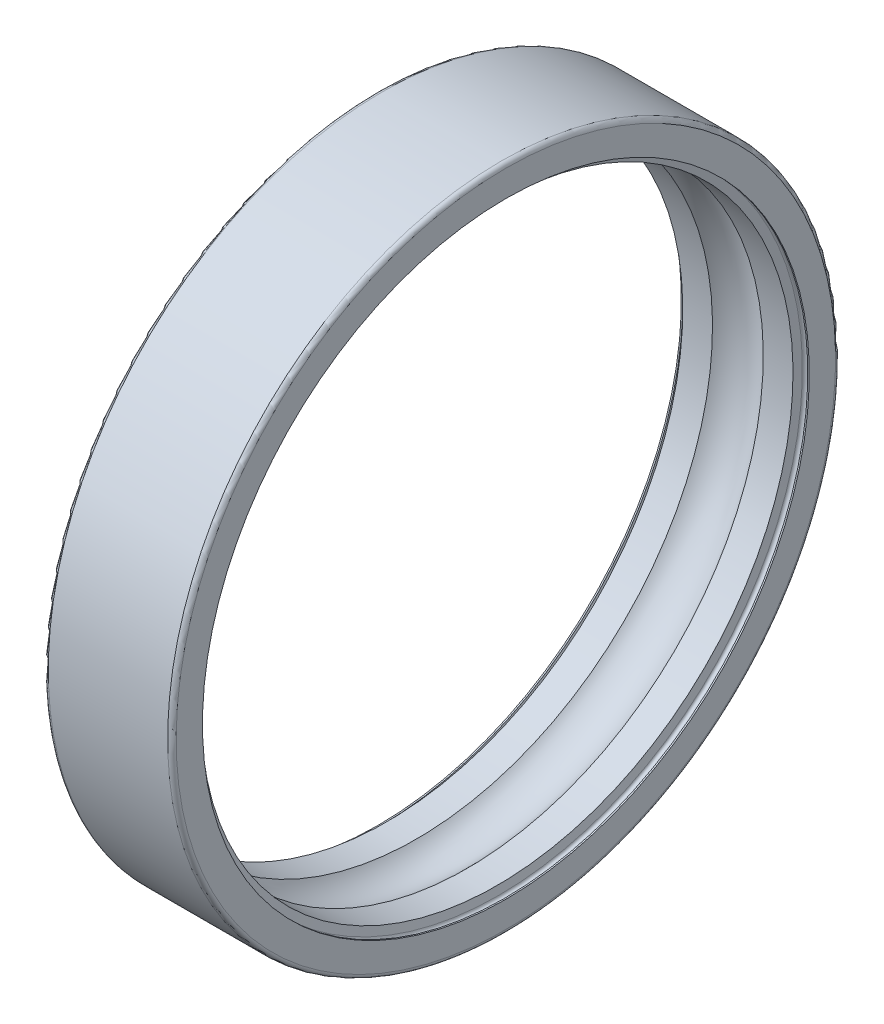
ISO-10303-21;
HEADER;
FILE_DESCRIPTION(('STEP AP214'),'2;1');
FILE_NAME('part.step','',(''),(''),'','','');
FILE_SCHEMA(('AUTOMOTIVE_DESIGN { 1 0 10303 214 1 1 1 1 }'));
ENDSEC;
DATA;
#1=APPLICATION_CONTEXT('core data for automotive mechanical design processes');
#2=APPLICATION_PROTOCOL_DEFINITION('international standard','automotive_design',2000,#1);
#3=PRODUCT_CONTEXT('',#1,'mechanical');
#4=PRODUCT('Part','Part','',(#3));
#5=PRODUCT_RELATED_PRODUCT_CATEGORY('part','',(#4));
#6=PRODUCT_DEFINITION_FORMATION('','',#4);
#7=PRODUCT_DEFINITION_CONTEXT('part definition',#1,'design');
#8=PRODUCT_DEFINITION('design','',#6,#7);
#9=PRODUCT_DEFINITION_SHAPE('','',#8);
#10=(LENGTH_UNIT() NAMED_UNIT(*) SI_UNIT(.MILLI.,.METRE.));
#11=(NAMED_UNIT(*) PLANE_ANGLE_UNIT() SI_UNIT($,.RADIAN.));
#12=(NAMED_UNIT(*) SI_UNIT($,.STERADIAN.) SOLID_ANGLE_UNIT());
#13=UNCERTAINTY_MEASURE_WITH_UNIT(LENGTH_MEASURE(1.E-05),#10,'distance_accuracy_value','');
#14=(GEOMETRIC_REPRESENTATION_CONTEXT(3) GLOBAL_UNCERTAINTY_ASSIGNED_CONTEXT((#13)) GLOBAL_UNIT_ASSIGNED_CONTEXT((#10,
#11,#12)) REPRESENTATION_CONTEXT('',''));
#15=CARTESIAN_POINT('',(0.,0.,0.));
#16=DIRECTION('',(0.,0.,1.));
#17=DIRECTION('',(1.,0.,0.));
#18=AXIS2_PLACEMENT_3D('',#15,#16,#17);
#19=CARTESIAN_POINT('',(8.685,0.,0.));
#20=DIRECTION('',(1.,0.,0.));
#21=DIRECTION('',(0.,0.,-1.));
#22=AXIS2_PLACEMENT_3D('',#19,#20,#21);
#23=TOROIDAL_SURFACE('',#22,21.35,0.21);
#24=CARTESIAN_POINT('',(8.895,0.,0.));
#25=DIRECTION('',(1.,0.,0.));
#26=DIRECTION('',(0.,1.,0.));
#27=AXIS2_PLACEMENT_3D('',#24,#25,#26);
#28=CIRCLE('',#27,21.35);
#29=CARTESIAN_POINT('',(8.895,21.35,0.));
#30=VERTEX_POINT('',#29);
#31=EDGE_CURVE('E11',#30,#30,#28,.T.);
#32=ORIENTED_EDGE('',*,*,#31,.T.);
#33=EDGE_LOOP('',(#32));
#34=FACE_BOUND('',#33,.T.);
#35=CARTESIAN_POINT('',(8.47819037186743,0.,0.));
#36=DIRECTION('',(1.,0.,0.));
#37=DIRECTION('',(0.,1.,0.));
#38=AXIS2_PLACEMENT_3D('',#35,#36,#37);
#39=CIRCLE('',#38,21.38646611731);
#40=CARTESIAN_POINT('',(8.47819037186743,21.38646611731,0.));
#41=VERTEX_POINT('',#40);
#42=EDGE_CURVE('E70',#41,#41,#39,.T.);
#43=ORIENTED_EDGE('',*,*,#42,.F.);
#44=EDGE_LOOP('',(#43));
#45=FACE_BOUND('',#44,.T.);
#46=ADVANCED_FACE('F16',(#34,#45),#23,.F.);
#47=CARTESIAN_POINT('',(8.9475,0.,0.));
#48=DIRECTION('',(-1.,0.,0.));
#49=DIRECTION('',(0.,1.,0.));
#50=AXIS2_PLACEMENT_3D('',#47,#48,#49);
#51=CYLINDRICAL_SURFACE('',#50,21.35);
#52=CARTESIAN_POINT('',(9.,0.,0.));
#53=DIRECTION('',(1.,0.,0.));
#54=DIRECTION('',(0.,1.,0.));
#55=AXIS2_PLACEMENT_3D('',#52,#53,#54);
#56=CIRCLE('',#55,21.35);
#57=CARTESIAN_POINT('',(9.,21.35,0.));
#58=VERTEX_POINT('',#57);
#59=EDGE_CURVE('E26',#58,#58,#56,.T.);
#60=ORIENTED_EDGE('',*,*,#59,.T.);
#61=EDGE_LOOP('',(#60));
#62=FACE_BOUND('',#61,.T.);
#63=ORIENTED_EDGE('',*,*,#31,.F.);
#64=EDGE_LOOP('',(#63));
#65=FACE_BOUND('',#64,.T.);
#66=ADVANCED_FACE('F18',(#62,#65),#51,.F.);
#67=CARTESIAN_POINT('',(9.,22.275,0.));
#68=DIRECTION('',(1.,0.,0.));
#69=DIRECTION('',(0.,1.,0.));
#70=AXIS2_PLACEMENT_3D('',#67,#68,#69);
#71=PLANE('',#70);
#72=CARTESIAN_POINT('',(9.,0.,0.));
#73=DIRECTION('',(1.,0.,0.));
#74=DIRECTION('',(0.,1.,0.));
#75=AXIS2_PLACEMENT_3D('',#72,#73,#74);
#76=CIRCLE('',#75,23.2);
#77=CARTESIAN_POINT('',(9.,23.2,0.));
#78=VERTEX_POINT('',#77);
#79=EDGE_CURVE('E79',#78,#78,#76,.T.);
#80=ORIENTED_EDGE('',*,*,#79,.T.);
#81=EDGE_LOOP('',(#80));
#82=FACE_BOUND('',#81,.T.);
#83=ORIENTED_EDGE('',*,*,#59,.F.);
#84=EDGE_LOOP('',(#83));
#85=FACE_BOUND('',#84,.T.);
#86=ADVANCED_FACE('F80',(#82,#85),#71,.T.);
#87=CARTESIAN_POINT('',(8.7,0.,0.));
#88=DIRECTION('',(1.,0.,0.));
#89=DIRECTION('',(0.,0.,-1.));
#90=AXIS2_PLACEMENT_3D('',#87,#88,#89);
#91=TOROIDAL_SURFACE('',#90,23.2,0.3);
#92=CARTESIAN_POINT('',(8.7,0.,0.));
#93=DIRECTION('',(1.,0.,0.));
#94=DIRECTION('',(0.,1.,0.));
#95=AXIS2_PLACEMENT_3D('',#92,#93,#94);
#96=CIRCLE('',#95,23.5);
#97=CARTESIAN_POINT('',(8.7,23.5,0.));
#98=VERTEX_POINT('',#97);
#99=EDGE_CURVE('E20',#98,#98,#96,.T.);
#100=ORIENTED_EDGE('',*,*,#99,.T.);
#101=EDGE_LOOP('',(#100));
#102=FACE_BOUND('',#101,.T.);
#103=ORIENTED_EDGE('',*,*,#79,.F.);
#104=EDGE_LOOP('',(#103));
#105=FACE_BOUND('',#104,.T.);
#106=ADVANCED_FACE('F137',(#102,#105),#91,.T.);
#107=CARTESIAN_POINT('',(4.5,0.,0.));
#108=DIRECTION('',(-1.,0.,0.));
#109=DIRECTION('',(0.,1.,0.));
#110=AXIS2_PLACEMENT_3D('',#107,#108,#109);
#111=CYLINDRICAL_SURFACE('',#110,23.5);
#112=CARTESIAN_POINT('',(0.3,0.,0.));
#113=DIRECTION('',(1.,0.,0.));
#114=DIRECTION('',(0.,1.,0.));
#115=AXIS2_PLACEMENT_3D('',#112,#113,#114);
#116=CIRCLE('',#115,23.5);
#117=CARTESIAN_POINT('',(0.3,23.5,0.));
#118=VERTEX_POINT('',#117);
#119=EDGE_CURVE('E85',#118,#118,#116,.T.);
#120=ORIENTED_EDGE('',*,*,#119,.T.);
#121=EDGE_LOOP('',(#120));
#122=FACE_BOUND('',#121,.T.);
#123=ORIENTED_EDGE('',*,*,#99,.F.);
#124=EDGE_LOOP('',(#123));
#125=FACE_BOUND('',#124,.T.);
#126=ADVANCED_FACE('F133',(#122,#125),#111,.T.);
#127=CARTESIAN_POINT('',(0.3,0.,0.));
#128=DIRECTION('',(1.,0.,0.));
#129=DIRECTION('',(0.,0.,-1.));
#130=AXIS2_PLACEMENT_3D('',#127,#128,#129);
#131=TOROIDAL_SURFACE('',#130,23.2,0.3);
#132=CARTESIAN_POINT('',(0.,0.,0.));
#133=DIRECTION('',(1.,0.,0.));
#134=DIRECTION('',(0.,1.,0.));
#135=AXIS2_PLACEMENT_3D('',#132,#133,#134);
#136=CIRCLE('',#135,23.2);
#137=CARTESIAN_POINT('',(0.,23.2,0.));
#138=VERTEX_POINT('',#137);
#139=EDGE_CURVE('E92',#138,#138,#136,.T.);
#140=ORIENTED_EDGE('',*,*,#139,.T.);
#141=EDGE_LOOP('',(#140));
#142=FACE_BOUND('',#141,.T.);
#143=ORIENTED_EDGE('',*,*,#119,.F.);
#144=EDGE_LOOP('',(#143));
#145=FACE_BOUND('',#144,.T.);
#146=ADVANCED_FACE('F145',(#142,#145),#131,.T.);
#147=CARTESIAN_POINT('',(0.,22.275,0.));
#148=DIRECTION('',(-1.,0.,0.));
#149=DIRECTION('',(0.,-1.,0.));
#150=AXIS2_PLACEMENT_3D('',#147,#148,#149);
#151=PLANE('',#150);
#152=CARTESIAN_POINT('',(0.,0.,0.));
#153=DIRECTION('',(1.,0.,0.));
#154=DIRECTION('',(0.,1.,0.));
#155=AXIS2_PLACEMENT_3D('',#152,#153,#154);
#156=CIRCLE('',#155,21.35);
#157=CARTESIAN_POINT('',(0.,21.35,0.));
#158=VERTEX_POINT('',#157);
#159=EDGE_CURVE('E95',#158,#158,#156,.T.);
#160=ORIENTED_EDGE('',*,*,#159,.T.);
#161=EDGE_LOOP('',(#160));
#162=FACE_BOUND('',#161,.T.);
#163=ORIENTED_EDGE('',*,*,#139,.F.);
#164=EDGE_LOOP('',(#163));
#165=FACE_BOUND('',#164,.T.);
#166=ADVANCED_FACE('F142',(#162,#165),#151,.T.);
#167=CARTESIAN_POINT('',(0.0525,0.,0.));
#168=DIRECTION('',(-1.,0.,0.));
#169=DIRECTION('',(0.,1.,0.));
#170=AXIS2_PLACEMENT_3D('',#167,#168,#169);
#171=CYLINDRICAL_SURFACE('',#170,21.35);
#172=CARTESIAN_POINT('',(0.105,0.,0.));
#173=DIRECTION('',(1.,0.,0.));
#174=DIRECTION('',(0.,1.,0.));
#175=AXIS2_PLACEMENT_3D('',#172,#173,#174);
#176=CIRCLE('',#175,21.35);
#177=CARTESIAN_POINT('',(0.105,21.35,0.));
#178=VERTEX_POINT('',#177);
#179=EDGE_CURVE('E93',#178,#178,#176,.T.);
#180=ORIENTED_EDGE('',*,*,#179,.T.);
#181=EDGE_LOOP('',(#180));
#182=FACE_BOUND('',#181,.T.);
#183=ORIENTED_EDGE('',*,*,#159,.F.);
#184=EDGE_LOOP('',(#183));
#185=FACE_BOUND('',#184,.T.);
#186=ADVANCED_FACE('F140',(#182,#185),#171,.F.);
#187=CARTESIAN_POINT('',(0.315,0.,0.));
#188=DIRECTION('',(1.,0.,0.));
#189=DIRECTION('',(0.,0.,-1.));
#190=AXIS2_PLACEMENT_3D('',#187,#188,#189);
#191=TOROIDAL_SURFACE('',#190,21.35,0.21);
#192=CARTESIAN_POINT('',(0.521809628132566,0.,0.));
#193=DIRECTION('',(1.,0.,0.));
#194=DIRECTION('',(0.,1.,0.));
#195=AXIS2_PLACEMENT_3D('',#192,#193,#194);
#196=CIRCLE('',#195,21.38646611731);
#197=CARTESIAN_POINT('',(0.521809628132566,21.38646611731,0.));
#198=VERTEX_POINT('',#197);
#199=EDGE_CURVE('E55',#198,#198,#196,.T.);
#200=ORIENTED_EDGE('',*,*,#199,.T.);
#201=EDGE_LOOP('',(#200));
#202=FACE_BOUND('',#201,.T.);
#203=ORIENTED_EDGE('',*,*,#179,.F.);
#204=EDGE_LOOP('',(#203));
#205=FACE_BOUND('',#204,.T.);
#206=ADVANCED_FACE('F138',(#202,#205),#191,.F.);
#207=CARTESIAN_POINT('',(0.571310440750258,0.,0.));
#208=DIRECTION('',(-1.,0.,0.));
#209=DIRECTION('',(0.,1.,0.));
#210=AXIS2_PLACEMENT_3D('',#207,#208,#209);
#211=CONICAL_SURFACE('',#210,21.105733058655,1.39626340159546);
#212=CARTESIAN_POINT('',(0.620811253367952,0.,0.));
#213=DIRECTION('',(1.,0.,0.));
#214=DIRECTION('',(0.,1.,0.));
#215=AXIS2_PLACEMENT_3D('',#212,#213,#214);
#216=CIRCLE('',#215,20.825);
#217=CARTESIAN_POINT('',(0.620811253367952,20.825,0.));
#218=VERTEX_POINT('',#217);
#219=EDGE_CURVE('E61',#218,#218,#216,.T.);
#220=ORIENTED_EDGE('',*,*,#219,.T.);
#221=EDGE_LOOP('',(#220));
#222=FACE_BOUND('',#221,.T.);
#223=ORIENTED_EDGE('',*,*,#199,.F.);
#224=EDGE_LOOP('',(#223));
#225=FACE_BOUND('',#224,.T.);
#226=ADVANCED_FACE('F120',(#222,#225),#211,.F.);
#227=CARTESIAN_POINT('',(1.66758201588507,0.,0.));
#228=DIRECTION('',(-1.,0.,0.));
#229=DIRECTION('',(0.,1.,0.));
#230=AXIS2_PLACEMENT_3D('',#227,#228,#229);
#231=CYLINDRICAL_SURFACE('',#230,20.825);
#232=CARTESIAN_POINT('',(2.71435277840218,0.,0.));
#233=DIRECTION('',(1.,0.,0.));
#234=DIRECTION('',(0.,1.,0.));
#235=AXIS2_PLACEMENT_3D('',#232,#233,#234);
#236=CIRCLE('',#235,20.825);
#237=CARTESIAN_POINT('',(2.71435277840219,20.825,0.));
#238=VERTEX_POINT('',#237);
#239=EDGE_CURVE('E88',#238,#238,#236,.T.);
#240=ORIENTED_EDGE('',*,*,#239,.T.);
#241=EDGE_LOOP('',(#240));
#242=FACE_BOUND('',#241,.T.);
#243=ORIENTED_EDGE('',*,*,#219,.F.);
#244=EDGE_LOOP('',(#243));
#245=FACE_BOUND('',#244,.T.);
#246=ADVANCED_FACE('F106',(#242,#245),#231,.F.);
#247=CARTESIAN_POINT('',(4.5,0.,0.));
#248=DIRECTION('',(1.,0.,0.));
#249=DIRECTION('',(0.,0.,-1.));
#250=AXIS2_PLACEMENT_3D('',#247,#248,#249);
#251=TOROIDAL_SURFACE('',#250,19.25,2.381);
#252=CARTESIAN_POINT('',(6.28564722159782,0.,0.));
#253=DIRECTION('',(1.,0.,0.));
#254=DIRECTION('',(0.,1.,0.));
#255=AXIS2_PLACEMENT_3D('',#252,#253,#254);
#256=CIRCLE('',#255,20.825);
#257=CARTESIAN_POINT('',(6.28564722159782,20.825,0.));
#258=VERTEX_POINT('',#257);
#259=EDGE_CURVE('E101',#258,#258,#256,.T.);
#260=ORIENTED_EDGE('',*,*,#259,.T.);
#261=EDGE_LOOP('',(#260));
#262=FACE_BOUND('',#261,.T.);
#263=ORIENTED_EDGE('',*,*,#239,.F.);
#264=EDGE_LOOP('',(#263));
#265=FACE_BOUND('',#264,.T.);
#266=ADVANCED_FACE('F109',(#262,#265),#251,.F.);
#267=CARTESIAN_POINT('',(7.33241798411493,0.,0.));
#268=DIRECTION('',(-1.,0.,0.));
#269=DIRECTION('',(0.,1.,0.));
#270=AXIS2_PLACEMENT_3D('',#267,#268,#269);
#271=CYLINDRICAL_SURFACE('',#270,20.825);
#272=CARTESIAN_POINT('',(8.37918874663205,0.,0.));
#273=DIRECTION('',(1.,0.,0.));
#274=DIRECTION('',(0.,1.,0.));
#275=AXIS2_PLACEMENT_3D('',#272,#273,#274);
#276=CIRCLE('',#275,20.825);
#277=CARTESIAN_POINT('',(8.37918874663205,20.825,0.));
#278=VERTEX_POINT('',#277);
#279=EDGE_CURVE('E75',#278,#278,#276,.T.);
#280=ORIENTED_EDGE('',*,*,#279,.T.);
#281=EDGE_LOOP('',(#280));
#282=FACE_BOUND('',#281,.T.);
#283=ORIENTED_EDGE('',*,*,#259,.F.);
#284=EDGE_LOOP('',(#283));
#285=FACE_BOUND('',#284,.T.);
#286=ADVANCED_FACE('F111',(#282,#285),#271,.F.);
#287=CARTESIAN_POINT('',(8.42868955924974,0.,0.));
#288=DIRECTION('',(1.,0.,0.));
#289=DIRECTION('',(0.,1.,0.));
#290=AXIS2_PLACEMENT_3D('',#287,#288,#289);
#291=CONICAL_SURFACE('',#290,21.105733058655,1.39626340159546);
#292=ORIENTED_EDGE('',*,*,#42,.T.);
#293=EDGE_LOOP('',(#292));
#294=FACE_BOUND('',#293,.T.);
#295=ORIENTED_EDGE('',*,*,#279,.F.);
#296=EDGE_LOOP('',(#295));
#297=FACE_BOUND('',#296,.T.);
#298=ADVANCED_FACE('F118',(#294,#297),#291,.F.);
#299=CLOSED_SHELL('',(#46,#66,#86,#106,#126,#146,#166,#186,#206,#226,#246,#266,#286,#298));
#300=MANIFOLD_SOLID_BREP('B1',#299);
#301=ADVANCED_BREP_SHAPE_REPRESENTATION('',(#18,#300),#14);
#302=SHAPE_DEFINITION_REPRESENTATION(#9,#301);
ENDSEC;
END-ISO-10303-21;
